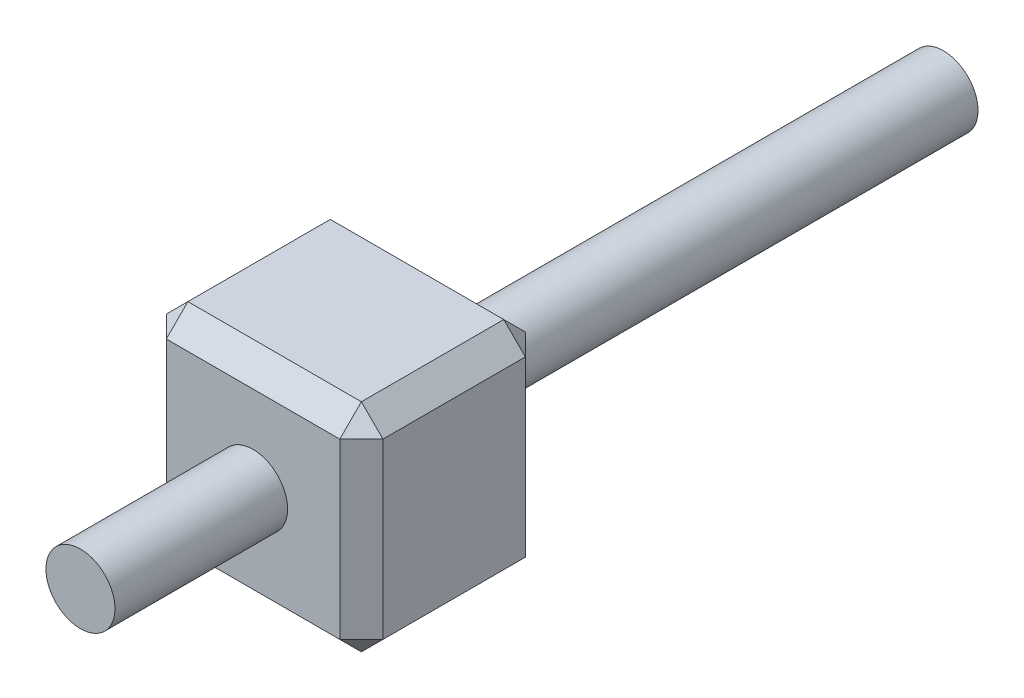
ISO-10303-21;
HEADER;
FILE_DESCRIPTION(('STEP AP214'),'2;1');
FILE_NAME('part.step','',(''),(''),'','','');
FILE_SCHEMA(('AUTOMOTIVE_DESIGN { 1 0 10303 214 1 1 1 1 }'));
ENDSEC;
DATA;
#1=APPLICATION_CONTEXT('core data for automotive mechanical design processes');
#2=APPLICATION_PROTOCOL_DEFINITION('international standard','automotive_design',2000,#1);
#3=PRODUCT_CONTEXT('',#1,'mechanical');
#4=PRODUCT('Part','Part','',(#3));
#5=PRODUCT_RELATED_PRODUCT_CATEGORY('part','',(#4));
#6=PRODUCT_DEFINITION_FORMATION('','',#4);
#7=PRODUCT_DEFINITION_CONTEXT('part definition',#1,'design');
#8=PRODUCT_DEFINITION('design','',#6,#7);
#9=PRODUCT_DEFINITION_SHAPE('','',#8);
#10=(LENGTH_UNIT() NAMED_UNIT(*) SI_UNIT(.MILLI.,.METRE.));
#11=(NAMED_UNIT(*) PLANE_ANGLE_UNIT() SI_UNIT($,.RADIAN.));
#12=(NAMED_UNIT(*) SI_UNIT($,.STERADIAN.) SOLID_ANGLE_UNIT());
#13=UNCERTAINTY_MEASURE_WITH_UNIT(LENGTH_MEASURE(1.E-05),#10,'distance_accuracy_value','');
#14=(GEOMETRIC_REPRESENTATION_CONTEXT(3) GLOBAL_UNCERTAINTY_ASSIGNED_CONTEXT((#13)) GLOBAL_UNIT_ASSIGNED_CONTEXT((#10,
#11,#12)) REPRESENTATION_CONTEXT('',''));
#15=CARTESIAN_POINT('',(0.,0.,0.));
#16=DIRECTION('',(0.,0.,1.));
#17=DIRECTION('',(1.,0.,0.));
#18=AXIS2_PLACEMENT_3D('',#15,#16,#17);
#19=CARTESIAN_POINT('',(-30.5004152134197,21.8097143331672,2.15));
#20=DIRECTION('',(0.,0.,1.));
#21=DIRECTION('',(1.,0.,0.));
#22=AXIS2_PLACEMENT_3D('',#19,#20,#21);
#23=PLANE('',#22);
#24=DIRECTION('',(-1.,0.,0.));
#25=VECTOR('',#24,1.);
#26=CARTESIAN_POINT('',(-30.5004152134197,24.0697143331672,2.15));
#27=LINE('',#26,#25);
#28=CARTESIAN_POINT('',(-28.2404152134197,24.0697143331672,2.15));
#29=VERTEX_POINT('',#28);
#30=CARTESIAN_POINT('',(-30.2504152134197,24.0697143331672,2.15));
#31=VERTEX_POINT('',#30);
#32=EDGE_CURVE('E125',#29,#31,#27,.T.);
#33=ORIENTED_EDGE('',*,*,#32,.T.);
#34=DIRECTION('',(0.,-1.,0.));
#35=VECTOR('',#34,1.);
#36=CARTESIAN_POINT('',(-30.2504152134197,21.8097143331672,2.15));
#37=LINE('',#36,#35);
#38=CARTESIAN_POINT('',(-30.2504152134197,22.0597143331672,2.15));
#39=VERTEX_POINT('',#38);
#40=EDGE_CURVE('E164',#31,#39,#37,.T.);
#41=ORIENTED_EDGE('',*,*,#40,.T.);
#42=DIRECTION('',(1.,0.,0.));
#43=VECTOR('',#42,1.);
#44=CARTESIAN_POINT('',(-27.9904152134197,22.0597143331672,2.15));
#45=LINE('',#44,#43);
#46=CARTESIAN_POINT('',(-28.2404152134197,22.0597143331672,2.15));
#47=VERTEX_POINT('',#46);
#48=EDGE_CURVE('E128',#39,#47,#45,.T.);
#49=ORIENTED_EDGE('',*,*,#48,.T.);
#50=DIRECTION('',(0.,1.,0.));
#51=VECTOR('',#50,1.);
#52=CARTESIAN_POINT('',(-28.2404152134197,24.3197143331672,2.15));
#53=LINE('',#52,#51);
#54=EDGE_CURVE('E120',#47,#29,#53,.T.);
#55=ORIENTED_EDGE('',*,*,#54,.T.);
#56=EDGE_LOOP('',(#33,#41,#49,#55));
#57=FACE_BOUND('',#56,.T.);
#58=CARTESIAN_POINT('',(-29.2454152134197,23.0647143331672,2.15));
#59=DIRECTION('',(0.,0.,1.));
#60=DIRECTION('',(1.,0.,0.));
#61=AXIS2_PLACEMENT_3D('',#58,#59,#60);
#62=CIRCLE('',#61,0.400000000000002);
#63=CARTESIAN_POINT('',(-28.8454152134197,23.0647143331672,2.15));
#64=VERTEX_POINT('',#63);
#65=EDGE_CURVE('E159',#64,#64,#62,.F.);
#66=ORIENTED_EDGE('',*,*,#65,.T.);
#67=EDGE_LOOP('',(#66));
#68=FACE_BOUND('',#67,.T.);
#69=ADVANCED_FACE('F35',(#57,#68),#23,.T.);
#70=CARTESIAN_POINT('',(-30.5004152134197,21.8097143331672,0.));
#71=DIRECTION('',(0.,0.,1.));
#72=DIRECTION('',(1.,0.,0.));
#73=AXIS2_PLACEMENT_3D('',#70,#71,#72);
#74=PLANE('',#73);
#75=DIRECTION('',(-1.,0.,0.));
#76=VECTOR('',#75,1.);
#77=CARTESIAN_POINT('',(-30.5004152134197,22.0597143331672,0.));
#78=LINE('',#77,#76);
#79=CARTESIAN_POINT('',(-28.2404152134197,22.0597143331672,0.));
#80=VERTEX_POINT('',#79);
#81=CARTESIAN_POINT('',(-30.2504152134197,22.0597143331672,0.));
#82=VERTEX_POINT('',#81);
#83=EDGE_CURVE('E179',#80,#82,#78,.T.);
#84=ORIENTED_EDGE('',*,*,#83,.T.);
#85=DIRECTION('',(0.,1.,0.));
#86=VECTOR('',#85,1.);
#87=CARTESIAN_POINT('',(-30.2504152134197,21.8097143331672,0.));
#88=LINE('',#87,#86);
#89=CARTESIAN_POINT('',(-30.2504152134197,24.0697143331672,0.));
#90=VERTEX_POINT('',#89);
#91=EDGE_CURVE('E181',#82,#90,#88,.T.);
#92=ORIENTED_EDGE('',*,*,#91,.T.);
#93=DIRECTION('',(1.,0.,0.));
#94=VECTOR('',#93,1.);
#95=CARTESIAN_POINT('',(-30.5004152134197,24.0697143331672,0.));
#96=LINE('',#95,#94);
#97=CARTESIAN_POINT('',(-28.2404152134197,24.0697143331672,0.));
#98=VERTEX_POINT('',#97);
#99=EDGE_CURVE('E175',#90,#98,#96,.T.);
#100=ORIENTED_EDGE('',*,*,#99,.T.);
#101=DIRECTION('',(0.,-1.,0.));
#102=VECTOR('',#101,1.);
#103=CARTESIAN_POINT('',(-28.2404152134197,21.8097143331672,0.));
#104=LINE('',#103,#102);
#105=EDGE_CURVE('E177',#98,#80,#104,.T.);
#106=ORIENTED_EDGE('',*,*,#105,.T.);
#107=EDGE_LOOP('',(#84,#92,#100,#106));
#108=FACE_BOUND('',#107,.T.);
#109=CARTESIAN_POINT('',(-29.2454152134197,23.0647143331672,0.));
#110=DIRECTION('',(0.,0.,1.));
#111=DIRECTION('',(1.,0.,0.));
#112=AXIS2_PLACEMENT_3D('',#109,#110,#111);
#113=CIRCLE('',#112,0.400000000000002);
#114=CARTESIAN_POINT('',(-28.8454152134197,23.0647143331672,0.));
#115=VERTEX_POINT('',#114);
#116=EDGE_CURVE('E156',#115,#115,#113,.F.);
#117=ORIENTED_EDGE('',*,*,#116,.F.);
#118=EDGE_LOOP('',(#117));
#119=FACE_BOUND('',#118,.T.);
#120=ADVANCED_FACE('F297',(#108,#119),#74,.F.);
#121=CARTESIAN_POINT('',(-30.5004152134197,24.3197143331672,2.15));
#122=DIRECTION('',(1.,0.,0.));
#123=DIRECTION('',(0.,0.,-1.));
#124=AXIS2_PLACEMENT_3D('',#121,#122,#123);
#125=PLANE('',#124);
#126=DIRECTION('',(0.,-1.,0.));
#127=VECTOR('',#126,1.);
#128=CARTESIAN_POINT('',(-30.5004152134197,24.3197143331672,0.25));
#129=LINE('',#128,#127);
#130=CARTESIAN_POINT('',(-30.5004152134197,24.0697143331672,0.25));
#131=VERTEX_POINT('',#130);
#132=CARTESIAN_POINT('',(-30.5004152134197,22.0597143331672,0.25));
#133=VERTEX_POINT('',#132);
#134=EDGE_CURVE('E168',#131,#133,#129,.T.);
#135=ORIENTED_EDGE('',*,*,#134,.T.);
#136=DIRECTION('',(0.,0.,1.));
#137=VECTOR('',#136,1.);
#138=CARTESIAN_POINT('',(-30.5004152134197,22.0597143331672,2.15));
#139=LINE('',#138,#137);
#140=CARTESIAN_POINT('',(-30.5004152134197,22.0597143331672,1.9));
#141=VERTEX_POINT('',#140);
#142=EDGE_CURVE('E173',#133,#141,#139,.T.);
#143=ORIENTED_EDGE('',*,*,#142,.T.);
#144=DIRECTION('',(0.,1.,0.));
#145=VECTOR('',#144,1.);
#146=CARTESIAN_POINT('',(-30.5004152134197,24.3197143331672,1.9));
#147=LINE('',#146,#145);
#148=CARTESIAN_POINT('',(-30.5004152134197,24.0697143331672,1.9));
#149=VERTEX_POINT('',#148);
#150=EDGE_CURVE('E170',#141,#149,#147,.T.);
#151=ORIENTED_EDGE('',*,*,#150,.T.);
#152=DIRECTION('',(0.,0.,-1.));
#153=VECTOR('',#152,1.);
#154=CARTESIAN_POINT('',(-30.5004152134197,24.0697143331672,2.15));
#155=LINE('',#154,#153);
#156=EDGE_CURVE('E166',#149,#131,#155,.T.);
#157=ORIENTED_EDGE('',*,*,#156,.T.);
#158=EDGE_LOOP('',(#135,#143,#151,#157));
#159=FACE_BOUND('',#158,.T.);
#160=ADVANCED_FACE('F37',(#159),#125,.F.);
#161=CARTESIAN_POINT('',(-30.5004152134197,21.8097143331672,2.15));
#162=DIRECTION('',(0.,1.,0.));
#163=DIRECTION('',(0.,0.,1.));
#164=AXIS2_PLACEMENT_3D('',#161,#162,#163);
#165=PLANE('',#164);
#166=DIRECTION('',(-1.,0.,0.));
#167=VECTOR('',#166,1.);
#168=CARTESIAN_POINT('',(-30.5004152134197,21.8097143331672,1.9));
#169=LINE('',#168,#167);
#170=CARTESIAN_POINT('',(-28.2404152134197,21.8097143331672,1.9));
#171=VERTEX_POINT('',#170);
#172=CARTESIAN_POINT('',(-30.2504152134197,21.8097143331672,1.9));
#173=VERTEX_POINT('',#172);
#174=EDGE_CURVE('E188',#171,#173,#169,.T.);
#175=ORIENTED_EDGE('',*,*,#174,.T.);
#176=DIRECTION('',(0.,0.,-1.));
#177=VECTOR('',#176,1.);
#178=CARTESIAN_POINT('',(-30.2504152134197,21.8097143331672,2.15));
#179=LINE('',#178,#177);
#180=CARTESIAN_POINT('',(-30.2504152134197,21.8097143331672,0.25));
#181=VERTEX_POINT('',#180);
#182=EDGE_CURVE('E190',#173,#181,#179,.T.);
#183=ORIENTED_EDGE('',*,*,#182,.T.);
#184=DIRECTION('',(1.,0.,0.));
#185=VECTOR('',#184,1.);
#186=CARTESIAN_POINT('',(-30.5004152134197,21.8097143331672,0.25));
#187=LINE('',#186,#185);
#188=CARTESIAN_POINT('',(-28.2404152134197,21.8097143331672,0.25));
#189=VERTEX_POINT('',#188);
#190=EDGE_CURVE('E186',#181,#189,#187,.T.);
#191=ORIENTED_EDGE('',*,*,#190,.T.);
#192=DIRECTION('',(0.,0.,1.));
#193=VECTOR('',#192,1.);
#194=CARTESIAN_POINT('',(-28.2404152134197,21.8097143331672,2.15));
#195=LINE('',#194,#193);
#196=EDGE_CURVE('E184',#189,#171,#195,.T.);
#197=ORIENTED_EDGE('',*,*,#196,.T.);
#198=EDGE_LOOP('',(#175,#183,#191,#197));
#199=FACE_BOUND('',#198,.T.);
#200=ADVANCED_FACE('F310',(#199),#165,.F.);
#201=CARTESIAN_POINT('',(-27.9904152134197,24.3197143331672,2.15));
#202=DIRECTION('',(-1.,0.,0.));
#203=DIRECTION('',(0.,-1.,0.));
#204=AXIS2_PLACEMENT_3D('',#201,#202,#203);
#205=PLANE('',#204);
#206=DIRECTION('',(0.,-1.,0.));
#207=VECTOR('',#206,1.);
#208=CARTESIAN_POINT('',(-27.9904152134197,21.8097143331672,1.9));
#209=LINE('',#208,#207);
#210=CARTESIAN_POINT('',(-27.9904152134197,24.0697143331672,1.9));
#211=VERTEX_POINT('',#210);
#212=CARTESIAN_POINT('',(-27.9904152134197,22.0597143331672,1.9));
#213=VERTEX_POINT('',#212);
#214=EDGE_CURVE('E138',#211,#213,#209,.T.);
#215=ORIENTED_EDGE('',*,*,#214,.T.);
#216=DIRECTION('',(0.,0.,-1.));
#217=VECTOR('',#216,1.);
#218=CARTESIAN_POINT('',(-27.9904152134197,22.0597143331672,2.15));
#219=LINE('',#218,#217);
#220=CARTESIAN_POINT('',(-27.9904152134197,22.0597143331672,0.25));
#221=VERTEX_POINT('',#220);
#222=EDGE_CURVE('E198',#213,#221,#219,.T.);
#223=ORIENTED_EDGE('',*,*,#222,.T.);
#224=DIRECTION('',(0.,1.,0.));
#225=VECTOR('',#224,1.);
#226=CARTESIAN_POINT('',(-27.9904152134197,24.3197143331672,0.25));
#227=LINE('',#226,#225);
#228=CARTESIAN_POINT('',(-27.9904152134197,24.0697143331672,0.25));
#229=VERTEX_POINT('',#228);
#230=EDGE_CURVE('E195',#221,#229,#227,.T.);
#231=ORIENTED_EDGE('',*,*,#230,.T.);
#232=DIRECTION('',(0.,0.,1.));
#233=VECTOR('',#232,1.);
#234=CARTESIAN_POINT('',(-27.9904152134197,24.0697143331672,2.15));
#235=LINE('',#234,#233);
#236=EDGE_CURVE('E193',#229,#211,#235,.T.);
#237=ORIENTED_EDGE('',*,*,#236,.T.);
#238=EDGE_LOOP('',(#215,#223,#231,#237));
#239=FACE_BOUND('',#238,.T.);
#240=ADVANCED_FACE('F308',(#239),#205,.F.);
#241=CARTESIAN_POINT('',(-30.5004152134197,24.3197143331672,2.15));
#242=DIRECTION('',(0.,-1.,0.));
#243=DIRECTION('',(0.,0.,-1.));
#244=AXIS2_PLACEMENT_3D('',#241,#242,#243);
#245=PLANE('',#244);
#246=DIRECTION('',(1.,0.,0.));
#247=VECTOR('',#246,1.);
#248=CARTESIAN_POINT('',(-27.9904152134197,24.3197143331672,1.9));
#249=LINE('',#248,#247);
#250=CARTESIAN_POINT('',(-30.2504152134197,24.3197143331672,1.9));
#251=VERTEX_POINT('',#250);
#252=CARTESIAN_POINT('',(-28.2404152134197,24.3197143331672,1.9));
#253=VERTEX_POINT('',#252);
#254=EDGE_CURVE('E43',#251,#253,#249,.T.);
#255=ORIENTED_EDGE('',*,*,#254,.T.);
#256=DIRECTION('',(0.,0.,-1.));
#257=VECTOR('',#256,1.);
#258=CARTESIAN_POINT('',(-28.2404152134197,24.3197143331672,2.15));
#259=LINE('',#258,#257);
#260=CARTESIAN_POINT('',(-28.2404152134197,24.3197143331672,0.25));
#261=VERTEX_POINT('',#260);
#262=EDGE_CURVE('E11',#253,#261,#259,.T.);
#263=ORIENTED_EDGE('',*,*,#262,.T.);
#264=DIRECTION('',(-1.,0.,0.));
#265=VECTOR('',#264,1.);
#266=CARTESIAN_POINT('',(-30.5004152134197,24.3197143331672,0.25));
#267=LINE('',#266,#265);
#268=CARTESIAN_POINT('',(-30.2504152134197,24.3197143331672,0.25));
#269=VERTEX_POINT('',#268);
#270=EDGE_CURVE('E201',#261,#269,#267,.T.);
#271=ORIENTED_EDGE('',*,*,#270,.T.);
#272=DIRECTION('',(0.,0.,1.));
#273=VECTOR('',#272,1.);
#274=CARTESIAN_POINT('',(-30.2504152134197,24.3197143331672,2.15));
#275=LINE('',#274,#273);
#276=EDGE_CURVE('E53',#269,#251,#275,.T.);
#277=ORIENTED_EDGE('',*,*,#276,.T.);
#278=EDGE_LOOP('',(#255,#263,#271,#277));
#279=FACE_BOUND('',#278,.T.);
#280=ADVANCED_FACE('F204',(#279),#245,.F.);
#281=CARTESIAN_POINT('',(-29.2454152134197,23.0647143331672,-5.85));
#282=DIRECTION('',(0.,0.,1.));
#283=DIRECTION('',(1.,0.,0.));
#284=AXIS2_PLACEMENT_3D('',#281,#282,#283);
#285=PLANE('',#284);
#286=CARTESIAN_POINT('',(-29.2454152134197,23.0647143331672,-5.85));
#287=DIRECTION('',(0.,0.,1.));
#288=DIRECTION('',(1.,0.,0.));
#289=AXIS2_PLACEMENT_3D('',#286,#287,#288);
#290=CIRCLE('',#289,0.400000000000002);
#291=CARTESIAN_POINT('',(-28.8454152134197,23.0647143331672,-5.85));
#292=VERTEX_POINT('',#291);
#293=EDGE_CURVE('E270',#292,#292,#290,.T.);
#294=ORIENTED_EDGE('',*,*,#293,.F.);
#295=EDGE_LOOP('',(#294));
#296=FACE_BOUND('',#295,.T.);
#297=ADVANCED_FACE('F307',(#296),#285,.F.);
#298=CARTESIAN_POINT('',(-29.2454152134197,23.0647143331672,4.15));
#299=DIRECTION('',(0.,0.,-1.));
#300=DIRECTION('',(-1.,0.,0.));
#301=AXIS2_PLACEMENT_3D('',#298,#299,#300);
#302=CYLINDRICAL_SURFACE('',#301,0.400000000000002);
#303=ORIENTED_EDGE('',*,*,#293,.T.);
#304=EDGE_LOOP('',(#303));
#305=FACE_BOUND('',#304,.T.);
#306=ORIENTED_EDGE('',*,*,#116,.T.);
#307=EDGE_LOOP('',(#306));
#308=FACE_BOUND('',#307,.T.);
#309=ADVANCED_FACE('F282',(#305,#308),#302,.T.);
#310=ORIENTED_EDGE('',*,*,#65,.F.);
#311=EDGE_LOOP('',(#310));
#312=FACE_BOUND('',#311,.T.);
#313=CARTESIAN_POINT('',(-29.2454152134197,23.0647143331672,4.15));
#314=DIRECTION('',(0.,0.,1.));
#315=DIRECTION('',(1.,0.,0.));
#316=AXIS2_PLACEMENT_3D('',#313,#314,#315);
#317=CIRCLE('',#316,0.400000000000002);
#318=CARTESIAN_POINT('',(-28.8454152134197,23.0647143331672,4.15));
#319=VERTEX_POINT('',#318);
#320=EDGE_CURVE('E273',#319,#319,#317,.T.);
#321=ORIENTED_EDGE('',*,*,#320,.F.);
#322=EDGE_LOOP('',(#321));
#323=FACE_BOUND('',#322,.T.);
#324=ADVANCED_FACE('F278',(#312,#323),#302,.T.);
#325=CARTESIAN_POINT('',(-29.2454152134197,23.0647143331672,4.15));
#326=DIRECTION('',(0.,0.,1.));
#327=DIRECTION('',(1.,0.,0.));
#328=AXIS2_PLACEMENT_3D('',#325,#326,#327);
#329=PLANE('',#328);
#330=ORIENTED_EDGE('',*,*,#320,.T.);
#331=EDGE_LOOP('',(#330));
#332=FACE_BOUND('',#331,.T.);
#333=ADVANCED_FACE('F281',(#332),#329,.T.);
#334=CARTESIAN_POINT('',(-27.9904152134197,24.3197143331672,0.25));
#335=DIRECTION('',(-0.707106781186547,0.,0.707106781186547));
#336=DIRECTION('',(0.707106781186548,0.,0.707106781186548));
#337=AXIS2_PLACEMENT_3D('',#334,#335,#336);
#338=PLANE('',#337);
#339=DIRECTION('',(0.707106781186548,0.,0.707106781186548));
#340=VECTOR('',#339,1.);
#341=CARTESIAN_POINT('',(-27.9904152134197,24.0697143331672,0.25));
#342=LINE('',#341,#340);
#343=EDGE_CURVE('E267',#229,#98,#342,.F.);
#344=ORIENTED_EDGE('',*,*,#343,.F.);
#345=ORIENTED_EDGE('',*,*,#230,.F.);
#346=DIRECTION('',(-0.707106781186547,0.,-0.707106781186547));
#347=VECTOR('',#346,1.);
#348=CARTESIAN_POINT('',(-28.1154152134197,22.0597143331672,0.125));
#349=LINE('',#348,#347);
#350=EDGE_CURVE('E264',#80,#221,#349,.F.);
#351=ORIENTED_EDGE('',*,*,#350,.F.);
#352=ORIENTED_EDGE('',*,*,#105,.F.);
#353=EDGE_LOOP('',(#344,#345,#351,#352));
#354=FACE_BOUND('',#353,.T.);
#355=ADVANCED_FACE('F287',(#354),#338,.F.);
#356=CARTESIAN_POINT('',(-27.9904152134197,24.0697143331672,0.25));
#357=DIRECTION('',(0.577350269189626,0.577350269189626,-0.577350269189626));
#358=DIRECTION('',(-0.707106781186547,0.,-0.707106781186547));
#359=AXIS2_PLACEMENT_3D('',#356,#357,#358);
#360=PLANE('',#359);
#361=DIRECTION('',(-0.707106781186547,0.707106781186547,0.));
#362=VECTOR('',#361,1.);
#363=CARTESIAN_POINT('',(-27.9904152134197,24.0697143331672,0.25));
#364=LINE('',#363,#362);
#365=EDGE_CURVE('E259',#229,#261,#364,.T.);
#366=ORIENTED_EDGE('',*,*,#365,.F.);
#367=ORIENTED_EDGE('',*,*,#343,.T.);
#368=DIRECTION('',(0.,-0.707106781186547,-0.707106781186547));
#369=VECTOR('',#368,1.);
#370=CARTESIAN_POINT('',(-28.2404152134197,24.1947143331672,0.125));
#371=LINE('',#370,#369);
#372=EDGE_CURVE('E262',#261,#98,#371,.T.);
#373=ORIENTED_EDGE('',*,*,#372,.F.);
#374=EDGE_LOOP('',(#366,#367,#373));
#375=FACE_BOUND('',#374,.T.);
#376=ADVANCED_FACE('F292',(#375),#360,.T.);
#377=CARTESIAN_POINT('',(-28.2404152134197,21.8097143331672,0.25));
#378=DIRECTION('',(0.577350269189626,-0.577350269189626,-0.577350269189626));
#379=DIRECTION('',(-0.707106781186547,0.,-0.707106781186547));
#380=AXIS2_PLACEMENT_3D('',#377,#378,#379);
#381=PLANE('',#380);
#382=DIRECTION('',(0.,-0.707106781186547,0.707106781186547));
#383=VECTOR('',#382,1.);
#384=CARTESIAN_POINT('',(-28.2404152134197,21.8097143331672,0.25));
#385=LINE('',#384,#383);
#386=EDGE_CURVE('E254',#80,#189,#385,.T.);
#387=ORIENTED_EDGE('',*,*,#386,.F.);
#388=ORIENTED_EDGE('',*,*,#350,.T.);
#389=DIRECTION('',(0.707106781186547,0.707106781186547,0.));
#390=VECTOR('',#389,1.);
#391=CARTESIAN_POINT('',(-28.2404152134197,21.8097143331672,0.25));
#392=LINE('',#391,#390);
#393=EDGE_CURVE('E257',#189,#221,#392,.T.);
#394=ORIENTED_EDGE('',*,*,#393,.F.);
#395=EDGE_LOOP('',(#387,#388,#394));
#396=FACE_BOUND('',#395,.T.);
#397=ADVANCED_FACE('F355',(#396),#381,.T.);
#398=CARTESIAN_POINT('',(-30.5004152134197,24.3197143331672,0.25));
#399=DIRECTION('',(0.,-0.707106781186547,0.707106781186547));
#400=DIRECTION('',(0.,-0.707106781186548,-0.707106781186548));
#401=AXIS2_PLACEMENT_3D('',#398,#399,#400);
#402=PLANE('',#401);
#403=ORIENTED_EDGE('',*,*,#372,.T.);
#404=ORIENTED_EDGE('',*,*,#99,.F.);
#405=DIRECTION('',(0.,0.707106781186547,0.707106781186547));
#406=VECTOR('',#405,1.);
#407=CARTESIAN_POINT('',(-30.2504152134197,24.0697143331672,0.));
#408=LINE('',#407,#406);
#409=EDGE_CURVE('E209',#269,#90,#408,.F.);
#410=ORIENTED_EDGE('',*,*,#409,.F.);
#411=ORIENTED_EDGE('',*,*,#270,.F.);
#412=EDGE_LOOP('',(#403,#404,#410,#411));
#413=FACE_BOUND('',#412,.T.);
#414=ADVANCED_FACE('F211',(#413),#402,.F.);
#415=CARTESIAN_POINT('',(-28.2404152134197,24.3197143331672,2.15));
#416=DIRECTION('',(-0.707106781186547,-0.707106781186547,0.));
#417=DIRECTION('',(0.707106781186548,-0.707106781186548,0.));
#418=AXIS2_PLACEMENT_3D('',#415,#416,#417);
#419=PLANE('',#418);
#420=ORIENTED_EDGE('',*,*,#365,.T.);
#421=ORIENTED_EDGE('',*,*,#262,.F.);
#422=DIRECTION('',(0.707106781186547,-0.707106781186547,0.));
#423=VECTOR('',#422,1.);
#424=CARTESIAN_POINT('',(-28.1154152134197,24.1947143331672,1.9));
#425=LINE('',#424,#423);
#426=EDGE_CURVE('E142',#211,#253,#425,.F.);
#427=ORIENTED_EDGE('',*,*,#426,.F.);
#428=ORIENTED_EDGE('',*,*,#236,.F.);
#429=EDGE_LOOP('',(#420,#421,#427,#428));
#430=FACE_BOUND('',#429,.T.);
#431=ADVANCED_FACE('F384',(#430),#419,.F.);
#432=CARTESIAN_POINT('',(-28.2404152134197,21.8097143331672,2.15));
#433=DIRECTION('',(0.707106781186547,0.,0.707106781186547));
#434=DIRECTION('',(0.707106781186548,0.,-0.707106781186548));
#435=AXIS2_PLACEMENT_3D('',#432,#433,#434);
#436=PLANE('',#435);
#437=DIRECTION('',(-0.707106781186547,0.,0.707106781186547));
#438=VECTOR('',#437,1.);
#439=CARTESIAN_POINT('',(-28.2404152134197,22.0597143331672,2.15));
#440=LINE('',#439,#438);
#441=EDGE_CURVE('E143',#213,#47,#440,.T.);
#442=ORIENTED_EDGE('',*,*,#441,.F.);
#443=ORIENTED_EDGE('',*,*,#214,.F.);
#444=DIRECTION('',(0.707106781186548,0.,-0.707106781186548));
#445=VECTOR('',#444,1.);
#446=CARTESIAN_POINT('',(-28.2404152134197,24.0697143331672,2.15));
#447=LINE('',#446,#445);
#448=EDGE_CURVE('E135',#29,#211,#447,.T.);
#449=ORIENTED_EDGE('',*,*,#448,.F.);
#450=ORIENTED_EDGE('',*,*,#54,.F.);
#451=EDGE_LOOP('',(#442,#443,#449,#450));
#452=FACE_BOUND('',#451,.T.);
#453=ADVANCED_FACE('F137',(#452),#436,.T.);
#454=CARTESIAN_POINT('',(-27.9904152134197,22.0597143331672,2.15));
#455=DIRECTION('',(-0.707106781186547,0.707106781186547,0.));
#456=DIRECTION('',(-0.707106781186548,-0.707106781186548,0.));
#457=AXIS2_PLACEMENT_3D('',#454,#455,#456);
#458=PLANE('',#457);
#459=ORIENTED_EDGE('',*,*,#393,.T.);
#460=ORIENTED_EDGE('',*,*,#222,.F.);
#461=DIRECTION('',(-0.707106781186547,-0.707106781186547,0.));
#462=VECTOR('',#461,1.);
#463=CARTESIAN_POINT('',(-28.1154152134197,21.9347143331672,1.9));
#464=LINE('',#463,#462);
#465=EDGE_CURVE('E248',#171,#213,#464,.F.);
#466=ORIENTED_EDGE('',*,*,#465,.F.);
#467=ORIENTED_EDGE('',*,*,#196,.F.);
#468=EDGE_LOOP('',(#459,#460,#466,#467));
#469=FACE_BOUND('',#468,.T.);
#470=ADVANCED_FACE('F360',(#469),#458,.F.);
#471=CARTESIAN_POINT('',(-30.5004152134197,21.8097143331672,0.25));
#472=DIRECTION('',(0.,0.707106781186547,0.707106781186547));
#473=DIRECTION('',(0.,-0.707106781186548,0.707106781186548));
#474=AXIS2_PLACEMENT_3D('',#471,#472,#473);
#475=PLANE('',#474);
#476=ORIENTED_EDGE('',*,*,#386,.T.);
#477=ORIENTED_EDGE('',*,*,#190,.F.);
#478=DIRECTION('',(0.,0.707106781186547,-0.707106781186547));
#479=VECTOR('',#478,1.);
#480=CARTESIAN_POINT('',(-30.2504152134197,21.9347143331672,0.125));
#481=LINE('',#480,#479);
#482=EDGE_CURVE('E245',#82,#181,#481,.F.);
#483=ORIENTED_EDGE('',*,*,#482,.F.);
#484=ORIENTED_EDGE('',*,*,#83,.F.);
#485=EDGE_LOOP('',(#476,#477,#483,#484));
#486=FACE_BOUND('',#485,.T.);
#487=ADVANCED_FACE('F351',(#486),#475,.F.);
#488=CARTESIAN_POINT('',(-30.5004152134197,24.3197143331672,0.25));
#489=DIRECTION('',(0.707106781186547,0.,0.707106781186547));
#490=DIRECTION('',(0.707106781186548,0.,-0.707106781186548));
#491=AXIS2_PLACEMENT_3D('',#488,#489,#490);
#492=PLANE('',#491);
#493=DIRECTION('',(0.707106781186547,0.,-0.707106781186547));
#494=VECTOR('',#493,1.);
#495=CARTESIAN_POINT('',(-30.2504152134197,24.0697143331672,0.));
#496=LINE('',#495,#494);
#497=EDGE_CURVE('E215',#90,#131,#496,.F.);
#498=ORIENTED_EDGE('',*,*,#497,.F.);
#499=ORIENTED_EDGE('',*,*,#91,.F.);
#500=DIRECTION('',(-0.707106781186547,0.,0.707106781186547));
#501=VECTOR('',#500,1.);
#502=CARTESIAN_POINT('',(-30.5004152134197,22.0597143331672,0.25));
#503=LINE('',#502,#501);
#504=EDGE_CURVE('E221',#133,#82,#503,.F.);
#505=ORIENTED_EDGE('',*,*,#504,.F.);
#506=ORIENTED_EDGE('',*,*,#134,.F.);
#507=EDGE_LOOP('',(#498,#499,#505,#506));
#508=FACE_BOUND('',#507,.T.);
#509=ADVANCED_FACE('F344',(#508),#492,.F.);
#510=CARTESIAN_POINT('',(-30.2504152134197,24.0697143331672,0.));
#511=DIRECTION('',(-0.577350269189626,0.577350269189626,-0.577350269189626));
#512=DIRECTION('',(-0.707106781186547,0.,0.707106781186547));
#513=AXIS2_PLACEMENT_3D('',#510,#511,#512);
#514=PLANE('',#513);
#515=ORIENTED_EDGE('',*,*,#409,.T.);
#516=ORIENTED_EDGE('',*,*,#497,.T.);
#517=DIRECTION('',(-0.707106781186547,-0.707106781186547,0.));
#518=VECTOR('',#517,1.);
#519=CARTESIAN_POINT('',(-30.3754152134197,24.1947143331672,0.25));
#520=LINE('',#519,#518);
#521=EDGE_CURVE('E149',#269,#131,#520,.T.);
#522=ORIENTED_EDGE('',*,*,#521,.F.);
#523=EDGE_LOOP('',(#515,#516,#522));
#524=FACE_BOUND('',#523,.T.);
#525=ADVANCED_FACE('F218',(#524),#514,.T.);
#526=CARTESIAN_POINT('',(-28.2404152134197,24.0697143331672,2.15));
#527=DIRECTION('',(0.577350269189626,0.577350269189626,0.577350269189626));
#528=DIRECTION('',(0.707106781186547,0.,-0.707106781186547));
#529=AXIS2_PLACEMENT_3D('',#526,#527,#528);
#530=PLANE('',#529);
#531=ORIENTED_EDGE('',*,*,#448,.T.);
#532=ORIENTED_EDGE('',*,*,#426,.T.);
#533=DIRECTION('',(0.,-0.707106781186547,0.707106781186547));
#534=VECTOR('',#533,1.);
#535=CARTESIAN_POINT('',(-28.2404152134197,24.0697143331672,2.15));
#536=LINE('',#535,#534);
#537=EDGE_CURVE('E146',#29,#253,#536,.F.);
#538=ORIENTED_EDGE('',*,*,#537,.F.);
#539=EDGE_LOOP('',(#531,#532,#538));
#540=FACE_BOUND('',#539,.T.);
#541=ADVANCED_FACE('F147',(#540),#530,.T.);
#542=CARTESIAN_POINT('',(-28.2404152134197,22.0597143331672,2.15));
#543=DIRECTION('',(0.577350269189626,-0.577350269189626,0.577350269189626));
#544=DIRECTION('',(0.707106781186547,0.,-0.707106781186547));
#545=AXIS2_PLACEMENT_3D('',#542,#543,#544);
#546=PLANE('',#545);
#547=ORIENTED_EDGE('',*,*,#465,.T.);
#548=ORIENTED_EDGE('',*,*,#441,.T.);
#549=DIRECTION('',(0.,-0.707106781186547,-0.707106781186547));
#550=VECTOR('',#549,1.);
#551=CARTESIAN_POINT('',(-28.2404152134197,22.0597143331672,2.15));
#552=LINE('',#551,#550);
#553=EDGE_CURVE('E150',#171,#47,#552,.F.);
#554=ORIENTED_EDGE('',*,*,#553,.F.);
#555=EDGE_LOOP('',(#547,#548,#554));
#556=FACE_BOUND('',#555,.T.);
#557=ADVANCED_FACE('F363',(#556),#546,.T.);
#558=CARTESIAN_POINT('',(-30.5004152134197,22.0597143331672,0.25));
#559=DIRECTION('',(-0.577350269189626,-0.577350269189626,-0.577350269189626));
#560=DIRECTION('',(-0.707106781186547,0.,0.707106781186547));
#561=AXIS2_PLACEMENT_3D('',#558,#559,#560);
#562=PLANE('',#561);
#563=ORIENTED_EDGE('',*,*,#504,.T.);
#564=ORIENTED_EDGE('',*,*,#482,.T.);
#565=DIRECTION('',(0.707106781186547,-0.707106781186547,0.));
#566=VECTOR('',#565,1.);
#567=CARTESIAN_POINT('',(-30.5004152134197,22.0597143331672,0.25));
#568=LINE('',#567,#566);
#569=EDGE_CURVE('E228',#133,#181,#568,.T.);
#570=ORIENTED_EDGE('',*,*,#569,.F.);
#571=EDGE_LOOP('',(#563,#564,#570));
#572=FACE_BOUND('',#571,.T.);
#573=ADVANCED_FACE('F347',(#572),#562,.T.);
#574=CARTESIAN_POINT('',(-30.5004152134197,24.0697143331672,2.15));
#575=DIRECTION('',(0.707106781186547,-0.707106781186547,0.));
#576=DIRECTION('',(0.707106781186548,0.707106781186548,0.));
#577=AXIS2_PLACEMENT_3D('',#574,#575,#576);
#578=PLANE('',#577);
#579=ORIENTED_EDGE('',*,*,#521,.T.);
#580=ORIENTED_EDGE('',*,*,#156,.F.);
#581=DIRECTION('',(0.707106781186547,0.707106781186547,0.));
#582=VECTOR('',#581,1.);
#583=CARTESIAN_POINT('',(-30.5004152134197,24.0697143331672,1.9));
#584=LINE('',#583,#582);
#585=EDGE_CURVE('E226',#251,#149,#584,.F.);
#586=ORIENTED_EDGE('',*,*,#585,.F.);
#587=ORIENTED_EDGE('',*,*,#276,.F.);
#588=EDGE_LOOP('',(#579,#580,#586,#587));
#589=FACE_BOUND('',#588,.T.);
#590=ADVANCED_FACE('F224',(#589),#578,.F.);
#591=CARTESIAN_POINT('',(-30.5004152134197,24.0697143331672,2.15));
#592=DIRECTION('',(0.,0.707106781186547,0.707106781186547));
#593=DIRECTION('',(0.,-0.707106781186548,0.707106781186548));
#594=AXIS2_PLACEMENT_3D('',#591,#592,#593);
#595=PLANE('',#594);
#596=ORIENTED_EDGE('',*,*,#537,.T.);
#597=ORIENTED_EDGE('',*,*,#254,.F.);
#598=DIRECTION('',(0.,0.707106781186547,-0.707106781186547));
#599=VECTOR('',#598,1.);
#600=CARTESIAN_POINT('',(-30.2504152134197,24.1947143331672,2.025));
#601=LINE('',#600,#599);
#602=EDGE_CURVE('E154',#31,#251,#601,.T.);
#603=ORIENTED_EDGE('',*,*,#602,.F.);
#604=ORIENTED_EDGE('',*,*,#32,.F.);
#605=EDGE_LOOP('',(#596,#597,#603,#604));
#606=FACE_BOUND('',#605,.T.);
#607=ADVANCED_FACE('F152',(#606),#595,.T.);
#608=CARTESIAN_POINT('',(-30.5004152134197,22.0597143331672,2.15));
#609=DIRECTION('',(0.,-0.707106781186547,0.707106781186547));
#610=DIRECTION('',(0.,-0.707106781186548,-0.707106781186548));
#611=AXIS2_PLACEMENT_3D('',#608,#609,#610);
#612=PLANE('',#611);
#613=ORIENTED_EDGE('',*,*,#553,.T.);
#614=ORIENTED_EDGE('',*,*,#48,.F.);
#615=DIRECTION('',(0.,0.707106781186547,0.707106781186547));
#616=VECTOR('',#615,1.);
#617=CARTESIAN_POINT('',(-30.2504152134197,22.0597143331672,2.15));
#618=LINE('',#617,#616);
#619=EDGE_CURVE('E233',#173,#39,#618,.T.);
#620=ORIENTED_EDGE('',*,*,#619,.F.);
#621=ORIENTED_EDGE('',*,*,#174,.F.);
#622=EDGE_LOOP('',(#613,#614,#620,#621));
#623=FACE_BOUND('',#622,.T.);
#624=ADVANCED_FACE('F331',(#623),#612,.T.);
#625=CARTESIAN_POINT('',(-30.2504152134197,21.8097143331672,2.15));
#626=DIRECTION('',(0.707106781186547,0.707106781186547,0.));
#627=DIRECTION('',(-0.707106781186548,0.707106781186548,0.));
#628=AXIS2_PLACEMENT_3D('',#625,#626,#627);
#629=PLANE('',#628);
#630=ORIENTED_EDGE('',*,*,#569,.T.);
#631=ORIENTED_EDGE('',*,*,#182,.F.);
#632=DIRECTION('',(-0.707106781186547,0.707106781186547,0.));
#633=VECTOR('',#632,1.);
#634=CARTESIAN_POINT('',(-30.3754152134197,21.9347143331672,1.9));
#635=LINE('',#634,#633);
#636=EDGE_CURVE('E236',#141,#173,#635,.F.);
#637=ORIENTED_EDGE('',*,*,#636,.F.);
#638=ORIENTED_EDGE('',*,*,#142,.F.);
#639=EDGE_LOOP('',(#630,#631,#637,#638));
#640=FACE_BOUND('',#639,.T.);
#641=ADVANCED_FACE('F326',(#640),#629,.F.);
#642=CARTESIAN_POINT('',(-30.5004152134197,24.0697143331672,1.9));
#643=DIRECTION('',(-0.577350269189626,0.577350269189626,0.577350269189626));
#644=DIRECTION('',(0.707106781186547,0.,0.707106781186547));
#645=AXIS2_PLACEMENT_3D('',#642,#643,#644);
#646=PLANE('',#645);
#647=ORIENTED_EDGE('',*,*,#602,.T.);
#648=ORIENTED_EDGE('',*,*,#585,.T.);
#649=DIRECTION('',(0.707106781186547,0.,0.707106781186547));
#650=VECTOR('',#649,1.);
#651=CARTESIAN_POINT('',(-30.5004152134197,24.0697143331672,1.9));
#652=LINE('',#651,#650);
#653=EDGE_CURVE('E231',#31,#149,#652,.F.);
#654=ORIENTED_EDGE('',*,*,#653,.F.);
#655=EDGE_LOOP('',(#647,#648,#654));
#656=FACE_BOUND('',#655,.T.);
#657=ADVANCED_FACE('F230',(#656),#646,.T.);
#658=CARTESIAN_POINT('',(-30.2504152134197,22.0597143331672,2.15));
#659=DIRECTION('',(-0.577350269189626,-0.577350269189626,0.577350269189626));
#660=DIRECTION('',(0.707106781186547,0.,0.707106781186547));
#661=AXIS2_PLACEMENT_3D('',#658,#659,#660);
#662=PLANE('',#661);
#663=ORIENTED_EDGE('',*,*,#636,.T.);
#664=ORIENTED_EDGE('',*,*,#619,.T.);
#665=DIRECTION('',(-0.707106781186547,0.,-0.707106781186547));
#666=VECTOR('',#665,1.);
#667=CARTESIAN_POINT('',(-30.2504152134197,22.0597143331672,2.15));
#668=LINE('',#667,#666);
#669=EDGE_CURVE('E335',#141,#39,#668,.F.);
#670=ORIENTED_EDGE('',*,*,#669,.F.);
#671=EDGE_LOOP('',(#663,#664,#670));
#672=FACE_BOUND('',#671,.T.);
#673=ADVANCED_FACE('F334',(#672),#662,.T.);
#674=CARTESIAN_POINT('',(-30.2504152134197,21.8097143331672,2.15));
#675=DIRECTION('',(-0.707106781186547,0.,0.707106781186547));
#676=DIRECTION('',(0.707106781186548,0.,0.707106781186548));
#677=AXIS2_PLACEMENT_3D('',#674,#675,#676);
#678=PLANE('',#677);
#679=ORIENTED_EDGE('',*,*,#653,.T.);
#680=ORIENTED_EDGE('',*,*,#150,.F.);
#681=ORIENTED_EDGE('',*,*,#669,.T.);
#682=ORIENTED_EDGE('',*,*,#40,.F.);
#683=EDGE_LOOP('',(#679,#680,#681,#682));
#684=FACE_BOUND('',#683,.T.);
#685=ADVANCED_FACE('F339',(#684),#678,.T.);
#686=CLOSED_SHELL('',(#69,#120,#160,#200,#240,#280,#297,#309,#324,#333,#355,#376,#397,#414,#431,
#453,#470,#487,#509,#525,#541,#557,#573,#590,#607,#624,#641,#657,#673,#685));
#687=MANIFOLD_SOLID_BREP('B2',#686);
#688=ADVANCED_BREP_SHAPE_REPRESENTATION('',(#18,#687),#14);
#689=SHAPE_DEFINITION_REPRESENTATION(#9,#688);
ENDSEC;
END-ISO-10303-21;
